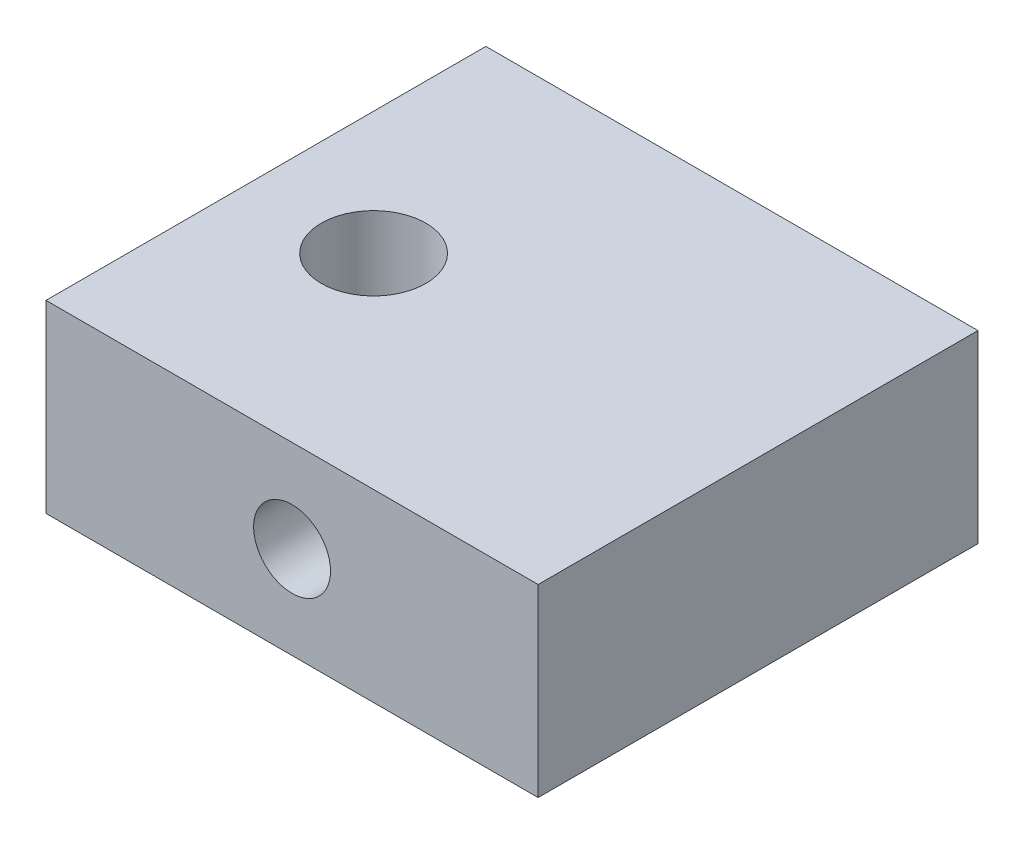
ISO-10303-21;
HEADER;
FILE_DESCRIPTION(('STEP AP214'),'2;1');
FILE_NAME('part.step','',(''),(''),'','','');
FILE_SCHEMA(('AUTOMOTIVE_DESIGN { 1 0 10303 214 1 1 1 1 }'));
ENDSEC;
DATA;
#1=APPLICATION_CONTEXT('core data for automotive mechanical design processes');
#2=APPLICATION_PROTOCOL_DEFINITION('international standard','automotive_design',2000,#1);
#3=PRODUCT_CONTEXT('',#1,'mechanical');
#4=PRODUCT('Part','Part','',(#3));
#5=PRODUCT_RELATED_PRODUCT_CATEGORY('part','',(#4));
#6=PRODUCT_DEFINITION_FORMATION('','',#4);
#7=PRODUCT_DEFINITION_CONTEXT('part definition',#1,'design');
#8=PRODUCT_DEFINITION('design','',#6,#7);
#9=PRODUCT_DEFINITION_SHAPE('','',#8);
#10=(LENGTH_UNIT() NAMED_UNIT(*) SI_UNIT(.MILLI.,.METRE.));
#11=(NAMED_UNIT(*) PLANE_ANGLE_UNIT() SI_UNIT($,.RADIAN.));
#12=(NAMED_UNIT(*) SI_UNIT($,.STERADIAN.) SOLID_ANGLE_UNIT());
#13=UNCERTAINTY_MEASURE_WITH_UNIT(LENGTH_MEASURE(1.E-05),#10,'distance_accuracy_value','');
#14=(GEOMETRIC_REPRESENTATION_CONTEXT(3) GLOBAL_UNCERTAINTY_ASSIGNED_CONTEXT((#13)) GLOBAL_UNIT_ASSIGNED_CONTEXT((#10,
#11,#12)) REPRESENTATION_CONTEXT('',''));
#15=CARTESIAN_POINT('',(0.,0.,0.));
#16=DIRECTION('',(0.,0.,1.));
#17=DIRECTION('',(1.,0.,0.));
#18=AXIS2_PLACEMENT_3D('',#15,#16,#17);
#19=CARTESIAN_POINT('',(150.,106.15,-103.));
#20=DIRECTION('',(0.,0.,1.));
#21=DIRECTION('',(1.,0.,0.));
#22=AXIS2_PLACEMENT_3D('',#19,#20,#21);
#23=CYLINDRICAL_SURFACE('',#22,1.25);
#24=CARTESIAN_POINT('',(150.,106.15,-86.85));
#25=DIRECTION('',(0.,0.,1.));
#26=DIRECTION('',(1.,0.,0.));
#27=AXIS2_PLACEMENT_3D('',#24,#25,#26);
#28=CIRCLE('',#27,1.25);
#29=CARTESIAN_POINT('',(151.25,106.15,-86.85));
#30=VERTEX_POINT('',#29);
#31=EDGE_CURVE('E121',#30,#30,#28,.T.);
#32=ORIENTED_EDGE('',*,*,#31,.T.);
#33=EDGE_LOOP('',(#32));
#34=FACE_BOUND('',#33,.T.);
#35=CARTESIAN_POINT('',(150.,106.15,-101.15));
#36=DIRECTION('',(0.,0.,1.));
#37=DIRECTION('',(1.,0.,0.));
#38=AXIS2_PLACEMENT_3D('',#35,#36,#37);
#39=CIRCLE('',#38,1.25);
#40=CARTESIAN_POINT('',(151.25,106.15,-101.15));
#41=VERTEX_POINT('',#40);
#42=EDGE_CURVE('E10',#41,#41,#39,.T.);
#43=ORIENTED_EDGE('',*,*,#42,.F.);
#44=EDGE_LOOP('',(#43));
#45=FACE_BOUND('',#44,.T.);
#46=ADVANCED_FACE('F16',(#34,#45),#23,.F.);
#47=CARTESIAN_POINT('',(146.,100.15,-93.5));
#48=DIRECTION('',(0.,1.,0.));
#49=DIRECTION('',(0.,0.,1.));
#50=AXIS2_PLACEMENT_3D('',#47,#48,#49);
#51=CYLINDRICAL_SURFACE('',#50,1.7);
#52=CARTESIAN_POINT('',(146.,109.15,-93.5));
#53=DIRECTION('',(0.,1.,0.));
#54=DIRECTION('',(0.,0.,1.));
#55=AXIS2_PLACEMENT_3D('',#52,#53,#54);
#56=CIRCLE('',#55,1.7);
#57=CARTESIAN_POINT('',(146.,109.15,-91.8));
#58=VERTEX_POINT('',#57);
#59=EDGE_CURVE('E126',#58,#58,#56,.T.);
#60=ORIENTED_EDGE('',*,*,#59,.T.);
#61=EDGE_LOOP('',(#60));
#62=FACE_BOUND('',#61,.T.);
#63=CARTESIAN_POINT('',(146.,103.15,-93.5));
#64=DIRECTION('',(0.,1.,0.));
#65=DIRECTION('',(0.,0.,1.));
#66=AXIS2_PLACEMENT_3D('',#63,#64,#65);
#67=CIRCLE('',#66,1.7);
#68=CARTESIAN_POINT('',(146.,103.15,-91.8));
#69=VERTEX_POINT('',#68);
#70=EDGE_CURVE('E110',#69,#69,#67,.T.);
#71=ORIENTED_EDGE('',*,*,#70,.F.);
#72=EDGE_LOOP('',(#71));
#73=FACE_BOUND('',#72,.T.);
#74=ADVANCED_FACE('F137',(#62,#73),#51,.F.);
#75=CARTESIAN_POINT('',(158.,103.15,-101.15));
#76=DIRECTION('',(1.,0.,0.));
#77=DIRECTION('',(0.,1.,0.));
#78=AXIS2_PLACEMENT_3D('',#75,#76,#77);
#79=PLANE('',#78);
#80=DIRECTION('',(0.,0.,1.));
#81=VECTOR('',#80,1.);
#82=CARTESIAN_POINT('',(158.,103.15,-101.15));
#83=LINE('',#82,#81);
#84=CARTESIAN_POINT('',(158.,103.15,-101.15));
#85=VERTEX_POINT('',#84);
#86=CARTESIAN_POINT('',(158.,103.15,-86.85));
#87=VERTEX_POINT('',#86);
#88=EDGE_CURVE('E76',#85,#87,#83,.T.);
#89=ORIENTED_EDGE('',*,*,#88,.F.);
#90=DIRECTION('',(0.,1.,0.));
#91=VECTOR('',#90,1.);
#92=CARTESIAN_POINT('',(158.,103.15,-101.15));
#93=LINE('',#92,#91);
#94=CARTESIAN_POINT('',(158.,109.15,-101.15));
#95=VERTEX_POINT('',#94);
#96=EDGE_CURVE('E25',#85,#95,#93,.T.);
#97=ORIENTED_EDGE('',*,*,#96,.T.);
#98=DIRECTION('',(0.,0.,1.));
#99=VECTOR('',#98,1.);
#100=CARTESIAN_POINT('',(158.,109.15,-101.15));
#101=LINE('',#100,#99);
#102=CARTESIAN_POINT('',(158.,109.15,-86.85));
#103=VERTEX_POINT('',#102);
#104=EDGE_CURVE('E42',#95,#103,#101,.T.);
#105=ORIENTED_EDGE('',*,*,#104,.T.);
#106=DIRECTION('',(0.,1.,0.));
#107=VECTOR('',#106,1.);
#108=CARTESIAN_POINT('',(158.,103.15,-86.85));
#109=LINE('',#108,#107);
#110=EDGE_CURVE('E114',#87,#103,#109,.T.);
#111=ORIENTED_EDGE('',*,*,#110,.F.);
#112=EDGE_LOOP('',(#89,#97,#105,#111));
#113=FACE_BOUND('',#112,.T.);
#114=ADVANCED_FACE('F18',(#113),#79,.T.);
#115=CARTESIAN_POINT('',(142.,103.15,-101.15));
#116=DIRECTION('',(0.,0.,1.));
#117=DIRECTION('',(1.,0.,0.));
#118=AXIS2_PLACEMENT_3D('',#115,#116,#117);
#119=PLANE('',#118);
#120=ORIENTED_EDGE('',*,*,#42,.T.);
#121=EDGE_LOOP('',(#120));
#122=FACE_BOUND('',#121,.T.);
#123=DIRECTION('',(1.,0.,0.));
#124=VECTOR('',#123,1.);
#125=CARTESIAN_POINT('',(142.,109.15,-101.15));
#126=LINE('',#125,#124);
#127=CARTESIAN_POINT('',(142.,109.15,-101.15));
#128=VERTEX_POINT('',#127);
#129=EDGE_CURVE('E117',#128,#95,#126,.T.);
#130=ORIENTED_EDGE('',*,*,#129,.T.);
#131=ORIENTED_EDGE('',*,*,#96,.F.);
#132=DIRECTION('',(1.,0.,0.));
#133=VECTOR('',#132,1.);
#134=CARTESIAN_POINT('',(142.,103.15,-101.15));
#135=LINE('',#134,#133);
#136=CARTESIAN_POINT('',(142.,103.15,-101.15));
#137=VERTEX_POINT('',#136);
#138=EDGE_CURVE('E81',#137,#85,#135,.T.);
#139=ORIENTED_EDGE('',*,*,#138,.F.);
#140=DIRECTION('',(0.,1.,0.));
#141=VECTOR('',#140,1.);
#142=CARTESIAN_POINT('',(142.,103.15,-101.15));
#143=LINE('',#142,#141);
#144=EDGE_CURVE('E89',#137,#128,#143,.T.);
#145=ORIENTED_EDGE('',*,*,#144,.T.);
#146=EDGE_LOOP('',(#130,#131,#139,#145));
#147=FACE_BOUND('',#146,.T.);
#148=ADVANCED_FACE('F143',(#122,#147),#119,.F.);
#149=CARTESIAN_POINT('',(142.,109.15,-101.15));
#150=DIRECTION('',(0.,1.,0.));
#151=DIRECTION('',(1.,0.,0.));
#152=AXIS2_PLACEMENT_3D('',#149,#150,#151);
#153=PLANE('',#152);
#154=ORIENTED_EDGE('',*,*,#59,.F.);
#155=EDGE_LOOP('',(#154));
#156=FACE_BOUND('',#155,.T.);
#157=ORIENTED_EDGE('',*,*,#129,.F.);
#158=DIRECTION('',(0.,0.,1.));
#159=VECTOR('',#158,1.);
#160=CARTESIAN_POINT('',(142.,109.15,-101.15));
#161=LINE('',#160,#159);
#162=CARTESIAN_POINT('',(142.,109.15,-86.85));
#163=VERTEX_POINT('',#162);
#164=EDGE_CURVE('E96',#128,#163,#161,.T.);
#165=ORIENTED_EDGE('',*,*,#164,.T.);
#166=DIRECTION('',(1.,0.,0.));
#167=VECTOR('',#166,1.);
#168=CARTESIAN_POINT('',(142.,109.15,-86.85));
#169=LINE('',#168,#167);
#170=EDGE_CURVE('E93',#163,#103,#169,.T.);
#171=ORIENTED_EDGE('',*,*,#170,.T.);
#172=ORIENTED_EDGE('',*,*,#104,.F.);
#173=EDGE_LOOP('',(#157,#165,#171,#172));
#174=FACE_BOUND('',#173,.T.);
#175=ADVANCED_FACE('F140',(#156,#174),#153,.T.);
#176=CARTESIAN_POINT('',(142.,103.15,-86.85));
#177=DIRECTION('',(0.,0.,1.));
#178=DIRECTION('',(1.,0.,0.));
#179=AXIS2_PLACEMENT_3D('',#176,#177,#178);
#180=PLANE('',#179);
#181=ORIENTED_EDGE('',*,*,#31,.F.);
#182=EDGE_LOOP('',(#181));
#183=FACE_BOUND('',#182,.T.);
#184=DIRECTION('',(0.,1.,0.));
#185=VECTOR('',#184,1.);
#186=CARTESIAN_POINT('',(142.,103.15,-86.85));
#187=LINE('',#186,#185);
#188=CARTESIAN_POINT('',(142.,103.15,-86.85));
#189=VERTEX_POINT('',#188);
#190=EDGE_CURVE('E87',#189,#163,#187,.T.);
#191=ORIENTED_EDGE('',*,*,#190,.F.);
#192=DIRECTION('',(1.,0.,0.));
#193=VECTOR('',#192,1.);
#194=CARTESIAN_POINT('',(142.,103.15,-86.85));
#195=LINE('',#194,#193);
#196=EDGE_CURVE('E70',#189,#87,#195,.T.);
#197=ORIENTED_EDGE('',*,*,#196,.T.);
#198=ORIENTED_EDGE('',*,*,#110,.T.);
#199=ORIENTED_EDGE('',*,*,#170,.F.);
#200=EDGE_LOOP('',(#191,#197,#198,#199));
#201=FACE_BOUND('',#200,.T.);
#202=ADVANCED_FACE('F92',(#183,#201),#180,.T.);
#203=CARTESIAN_POINT('',(142.,103.15,-101.15));
#204=DIRECTION('',(0.,1.,0.));
#205=DIRECTION('',(1.,0.,0.));
#206=AXIS2_PLACEMENT_3D('',#203,#204,#205);
#207=PLANE('',#206);
#208=ORIENTED_EDGE('',*,*,#70,.T.);
#209=EDGE_LOOP('',(#208));
#210=FACE_BOUND('',#209,.T.);
#211=ORIENTED_EDGE('',*,*,#88,.T.);
#212=ORIENTED_EDGE('',*,*,#196,.F.);
#213=DIRECTION('',(0.,0.,1.));
#214=VECTOR('',#213,1.);
#215=CARTESIAN_POINT('',(142.,103.15,-101.15));
#216=LINE('',#215,#214);
#217=EDGE_CURVE('E74',#137,#189,#216,.T.);
#218=ORIENTED_EDGE('',*,*,#217,.F.);
#219=ORIENTED_EDGE('',*,*,#138,.T.);
#220=EDGE_LOOP('',(#211,#212,#218,#219));
#221=FACE_BOUND('',#220,.T.);
#222=ADVANCED_FACE('F72',(#210,#221),#207,.F.);
#223=CARTESIAN_POINT('',(142.,103.15,-101.15));
#224=DIRECTION('',(1.,0.,0.));
#225=DIRECTION('',(0.,1.,0.));
#226=AXIS2_PLACEMENT_3D('',#223,#224,#225);
#227=PLANE('',#226);
#228=ORIENTED_EDGE('',*,*,#190,.T.);
#229=ORIENTED_EDGE('',*,*,#164,.F.);
#230=ORIENTED_EDGE('',*,*,#144,.F.);
#231=ORIENTED_EDGE('',*,*,#217,.T.);
#232=EDGE_LOOP('',(#228,#229,#230,#231));
#233=FACE_BOUND('',#232,.T.);
#234=ADVANCED_FACE('F85',(#233),#227,.F.);
#235=CLOSED_SHELL('',(#46,#74,#114,#148,#175,#202,#222,#234));
#236=MANIFOLD_SOLID_BREP('B1',#235);
#237=ADVANCED_BREP_SHAPE_REPRESENTATION('',(#18,#236),#14);
#238=SHAPE_DEFINITION_REPRESENTATION(#9,#237);
ENDSEC;
END-ISO-10303-21;
